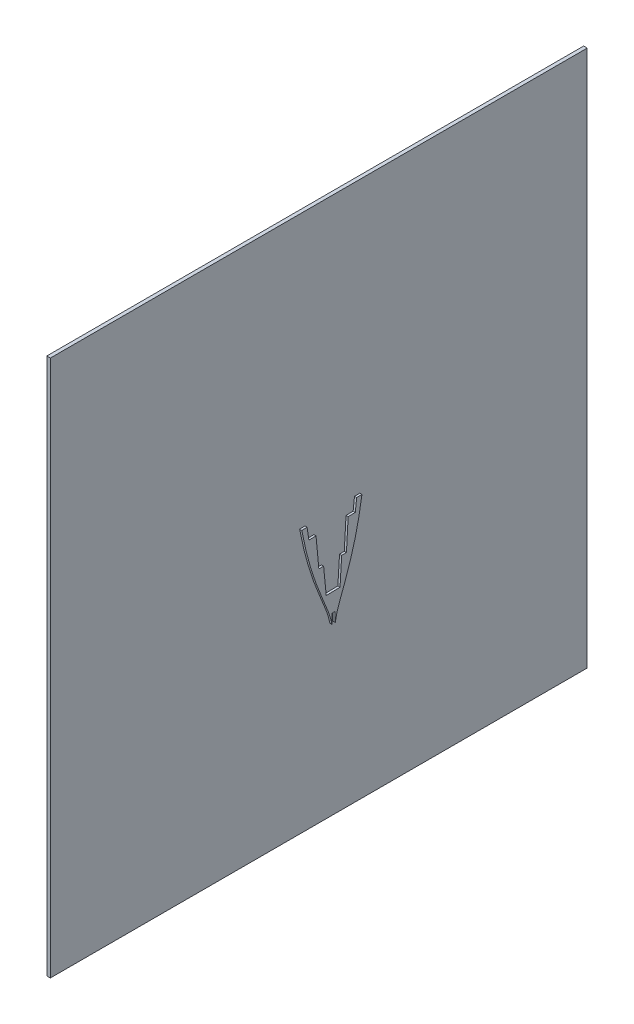
ISO-10303-21;
HEADER;
FILE_DESCRIPTION(('STEP AP214'),'2;1');
FILE_NAME('part.step','',(''),(''),'','','');
FILE_SCHEMA(('AUTOMOTIVE_DESIGN { 1 0 10303 214 1 1 1 1 }'));
ENDSEC;
DATA;
#1=APPLICATION_CONTEXT('core data for automotive mechanical design processes');
#2=APPLICATION_PROTOCOL_DEFINITION('international standard','automotive_design',2000,#1);
#3=PRODUCT_CONTEXT('',#1,'mechanical');
#4=PRODUCT('Part','Part','',(#3));
#5=PRODUCT_RELATED_PRODUCT_CATEGORY('part','',(#4));
#6=PRODUCT_DEFINITION_FORMATION('','',#4);
#7=PRODUCT_DEFINITION_CONTEXT('part definition',#1,'design');
#8=PRODUCT_DEFINITION('design','',#6,#7);
#9=PRODUCT_DEFINITION_SHAPE('','',#8);
#10=(LENGTH_UNIT() NAMED_UNIT(*) SI_UNIT(.MILLI.,.METRE.));
#11=(NAMED_UNIT(*) PLANE_ANGLE_UNIT() SI_UNIT($,.RADIAN.));
#12=(NAMED_UNIT(*) SI_UNIT($,.STERADIAN.) SOLID_ANGLE_UNIT());
#13=UNCERTAINTY_MEASURE_WITH_UNIT(LENGTH_MEASURE(1.E-05),#10,'distance_accuracy_value','');
#14=(GEOMETRIC_REPRESENTATION_CONTEXT(3) GLOBAL_UNCERTAINTY_ASSIGNED_CONTEXT((#13)) GLOBAL_UNIT_ASSIGNED_CONTEXT((#10,
#11,#12)) REPRESENTATION_CONTEXT('',''));
#15=CARTESIAN_POINT('',(0.,0.,0.));
#16=DIRECTION('',(0.,0.,1.));
#17=DIRECTION('',(1.,0.,0.));
#18=AXIS2_PLACEMENT_3D('',#15,#16,#17);
#19=CARTESIAN_POINT('',(6.,369.079430041121,90.7145035129025));
#20=CARTESIAN_POINT('',(6.,186.485173332269,57.0267938503836));
#21=CARTESIAN_POINT('',(6.,124.014601197404,2.24657128591706));
#22=CARTESIAN_POINT('',(6.,123.205843337659,2.23192033217919));
#23=CARTESIAN_POINT('',(6.,0.,0.));
#24=B_SPLINE_CURVE_WITH_KNOTS('',4,(#19,#20,#21,#22,#23),.UNSPECIFIED.,.F.,.F.,(5,5),(0.,1.),.UNSPECIFIED.);
#25=DIRECTION('',(-1.,0.,0.));
#26=VECTOR('',#25,1.);
#27=SURFACE_OF_LINEAR_EXTRUSION('',#24,#26);
#28=CARTESIAN_POINT('',(0.,369.079430041121,90.7145035129025));
#29=CARTESIAN_POINT('',(0.,186.485173332269,57.0267938503836));
#30=CARTESIAN_POINT('',(0.,124.014601197404,2.24657128591706));
#31=CARTESIAN_POINT('',(0.,123.205843337659,2.23192033217919));
#32=CARTESIAN_POINT('',(0.,0.,0.));
#33=B_SPLINE_CURVE_WITH_KNOTS('',4,(#28,#29,#30,#31,#32),.UNSPECIFIED.,.F.,.F.,(5,5),(0.,1.),.UNSPECIFIED.);
#34=CARTESIAN_POINT('',(0.,369.079430041121,90.7145035129025));
#35=VERTEX_POINT('',#34);
#36=CARTESIAN_POINT('',(0.,99.3171977063289,6.30064525545685));
#37=VERTEX_POINT('',#36);
#38=EDGE_CURVE('E194',#35,#37,#33,.T.);
#39=ORIENTED_EDGE('',*,*,#38,.T.);
#40=DIRECTION('',(1.,0.,0.));
#41=VECTOR('',#40,1.);
#42=CARTESIAN_POINT('',(0.,99.3171977063289,6.30064525545685));
#43=LINE('',#42,#41);
#44=CARTESIAN_POINT('',(6.,99.3171977063289,6.30064525545685));
#45=VERTEX_POINT('',#44);
#46=EDGE_CURVE('E200',#37,#45,#43,.T.);
#47=ORIENTED_EDGE('',*,*,#46,.T.);
#48=CARTESIAN_POINT('',(6.,369.079430041121,90.7145035129025));
#49=VERTEX_POINT('',#48);
#50=EDGE_CURVE('E234',#49,#45,#24,.T.);
#51=ORIENTED_EDGE('',*,*,#50,.F.);
#52=DIRECTION('',(-1.,0.,0.));
#53=VECTOR('',#52,1.);
#54=CARTESIAN_POINT('',(6.,369.079430041121,90.7145035129025));
#55=LINE('',#54,#53);
#56=EDGE_CURVE('E190',#49,#35,#55,.T.);
#57=ORIENTED_EDGE('',*,*,#56,.T.);
#58=EDGE_LOOP('',(#39,#47,#51,#57));
#59=FACE_BOUND('',#58,.T.);
#60=ADVANCED_FACE('F48',(#59),#27,.F.);
#61=CARTESIAN_POINT('',(6.,0.,0.));
#62=CARTESIAN_POINT('',(6.,123.205843337659,2.23192033217918));
#63=CARTESIAN_POINT('',(6.,124.014601197404,2.24657128591706));
#64=CARTESIAN_POINT('',(6.,188.42826292328,-50.2350955143506));
#65=CARTESIAN_POINT('',(6.,372.122846900139,-77.2873446432626));
#66=B_SPLINE_CURVE_WITH_KNOTS('',4,(#61,#62,#63,#64,#65),.UNSPECIFIED.,.F.,.F.,(5,5),(0.,1.),.UNSPECIFIED.);
#67=DIRECTION('',(-1.,0.,0.));
#68=VECTOR('',#67,1.);
#69=SURFACE_OF_LINEAR_EXTRUSION('',#66,#68);
#70=CARTESIAN_POINT('',(6.,99.480236101631,-2.69935474454315));
#71=VERTEX_POINT('',#70);
#72=CARTESIAN_POINT('',(6.,372.122846900139,-77.2873446432626));
#73=VERTEX_POINT('',#72);
#74=EDGE_CURVE('E131',#71,#73,#66,.T.);
#75=ORIENTED_EDGE('',*,*,#74,.F.);
#76=DIRECTION('',(1.,0.,0.));
#77=VECTOR('',#76,1.);
#78=CARTESIAN_POINT('',(0.,99.480236101631,-2.69935474454315));
#79=LINE('',#78,#77);
#80=CARTESIAN_POINT('',(0.,99.480236101631,-2.69935474454315));
#81=VERTEX_POINT('',#80);
#82=EDGE_CURVE('E326',#81,#71,#79,.T.);
#83=ORIENTED_EDGE('',*,*,#82,.F.);
#84=CARTESIAN_POINT('',(0.,0.,0.));
#85=CARTESIAN_POINT('',(0.,123.205843337659,2.23192033217918));
#86=CARTESIAN_POINT('',(0.,124.014601197404,2.24657128591706));
#87=CARTESIAN_POINT('',(0.,188.42826292328,-50.2350955143506));
#88=CARTESIAN_POINT('',(0.,372.122846900139,-77.2873446432626));
#89=B_SPLINE_CURVE_WITH_KNOTS('',4,(#84,#85,#86,#87,#88),.UNSPECIFIED.,.F.,.F.,(5,5),(0.,1.),.UNSPECIFIED.);
#90=CARTESIAN_POINT('',(0.,372.122846900139,-77.2873446432626));
#91=VERTEX_POINT('',#90);
#92=EDGE_CURVE('E199',#81,#91,#89,.T.);
#93=ORIENTED_EDGE('',*,*,#92,.T.);
#94=DIRECTION('',(-1.,0.,0.));
#95=VECTOR('',#94,1.);
#96=CARTESIAN_POINT('',(6.,372.122846900139,-77.2873446432626));
#97=LINE('',#96,#95);
#98=EDGE_CURVE('E13',#73,#91,#97,.T.);
#99=ORIENTED_EDGE('',*,*,#98,.F.);
#100=EDGE_LOOP('',(#75,#83,#93,#99));
#101=FACE_BOUND('',#100,.T.);
#102=ADVANCED_FACE('F338',(#101),#69,.F.);
#103=CARTESIAN_POINT('',(6.,372.122846900139,-77.2873446432626));
#104=DIRECTION('',(0.,-0.999835956927465,-0.0181124055536424));
#105=DIRECTION('',(0.,0.0181124055536424,-0.999835956927466));
#106=AXIS2_PLACEMENT_3D('',#103,#104,#105);
#107=PLANE('',#106);
#108=DIRECTION('',(0.,-0.0181124055536424,0.999835956927465));
#109=VECTOR('',#108,1.);
#110=CARTESIAN_POINT('',(0.,372.122846900139,-77.2873446432626));
#111=LINE('',#110,#109);
#112=CARTESIAN_POINT('',(0.,371.855243263812,-62.5151633881296));
#113=VERTEX_POINT('',#112);
#114=EDGE_CURVE('E207',#91,#113,#111,.T.);
#115=ORIENTED_EDGE('',*,*,#114,.T.);
#116=DIRECTION('',(-1.,0.,0.));
#117=VECTOR('',#116,1.);
#118=CARTESIAN_POINT('',(6.,371.855243263812,-62.5151633881296));
#119=LINE('',#118,#117);
#120=CARTESIAN_POINT('',(6.,371.855243263812,-62.5151633881296));
#121=VERTEX_POINT('',#120);
#122=EDGE_CURVE('E56',#121,#113,#119,.T.);
#123=ORIENTED_EDGE('',*,*,#122,.F.);
#124=DIRECTION('',(0.,-0.0181124055536424,0.999835956927465));
#125=VECTOR('',#124,1.);
#126=CARTESIAN_POINT('',(6.,372.122846900139,-77.2873446432626));
#127=LINE('',#126,#125);
#128=EDGE_CURVE('E320',#73,#121,#127,.T.);
#129=ORIENTED_EDGE('',*,*,#128,.F.);
#130=ORIENTED_EDGE('',*,*,#98,.T.);
#131=EDGE_LOOP('',(#115,#123,#129,#130));
#132=FACE_BOUND('',#131,.T.);
#133=ADVANCED_FACE('F341',(#132),#107,.F.);
#134=CARTESIAN_POINT('',(6.,371.855243263812,-62.5151633881296));
#135=DIRECTION('',(0.,-0.1115771381215,-0.99375577595736));
#136=DIRECTION('',(0.,0.993755775957361,-0.1115771381215));
#137=AXIS2_PLACEMENT_3D('',#134,#135,#136);
#138=PLANE('',#137);
#139=DIRECTION('',(0.,-0.993755775957361,0.1115771381215));
#140=VECTOR('',#139,1.);
#141=CARTESIAN_POINT('',(0.,371.855243263812,-62.5151633881296));
#142=LINE('',#141,#140);
#143=CARTESIAN_POINT('',(0.,337.907916836501,-58.7036177133518));
#144=VERTEX_POINT('',#143);
#145=EDGE_CURVE('E212',#113,#144,#142,.T.);
#146=ORIENTED_EDGE('',*,*,#145,.T.);
#147=DIRECTION('',(-1.,0.,0.));
#148=VECTOR('',#147,1.);
#149=CARTESIAN_POINT('',(6.,337.907916836501,-58.7036177133518));
#150=LINE('',#149,#148);
#151=CARTESIAN_POINT('',(6.,337.907916836501,-58.7036177133518));
#152=VERTEX_POINT('',#151);
#153=EDGE_CURVE('E259',#152,#144,#150,.T.);
#154=ORIENTED_EDGE('',*,*,#153,.F.);
#155=DIRECTION('',(0.,-0.993755775957361,0.1115771381215));
#156=VECTOR('',#155,1.);
#157=CARTESIAN_POINT('',(6.,371.855243263812,-62.5151633881296));
#158=LINE('',#157,#156);
#159=EDGE_CURVE('E268',#121,#152,#158,.T.);
#160=ORIENTED_EDGE('',*,*,#159,.F.);
#161=ORIENTED_EDGE('',*,*,#122,.T.);
#162=EDGE_LOOP('',(#146,#154,#160,#161));
#163=FACE_BOUND('',#162,.T.);
#164=ADVANCED_FACE('F266',(#163),#138,.F.);
#165=CARTESIAN_POINT('',(6.,337.907916836501,-58.7036177133518));
#166=DIRECTION('',(0.,-0.999835956927465,-0.0181124055536437));
#167=DIRECTION('',(0.,0.0181124055536437,-0.999835956927466));
#168=AXIS2_PLACEMENT_3D('',#165,#166,#167);
#169=PLANE('',#168);
#170=DIRECTION('',(0.,-0.0181124055536437,0.999835956927465));
#171=VECTOR('',#170,1.);
#172=CARTESIAN_POINT('',(0.,337.907916836501,-58.7036177133518));
#173=LINE('',#172,#171);
#174=CARTESIAN_POINT('',(0.,337.547213718344,-38.7921848426052));
#175=VERTEX_POINT('',#174);
#176=EDGE_CURVE('E214',#144,#175,#173,.T.);
#177=ORIENTED_EDGE('',*,*,#176,.T.);
#178=DIRECTION('',(-1.,0.,0.));
#179=VECTOR('',#178,1.);
#180=CARTESIAN_POINT('',(6.,337.547213718344,-38.7921848426052));
#181=LINE('',#180,#179);
#182=CARTESIAN_POINT('',(6.,337.547213718344,-38.7921848426052));
#183=VERTEX_POINT('',#182);
#184=EDGE_CURVE('E256',#183,#175,#181,.T.);
#185=ORIENTED_EDGE('',*,*,#184,.F.);
#186=DIRECTION('',(0.,-0.0181124055536437,0.999835956927465));
#187=VECTOR('',#186,1.);
#188=CARTESIAN_POINT('',(6.,337.907916836501,-58.7036177133518));
#189=LINE('',#188,#187);
#190=EDGE_CURVE('E290',#152,#183,#189,.T.);
#191=ORIENTED_EDGE('',*,*,#190,.F.);
#192=ORIENTED_EDGE('',*,*,#153,.T.);
#193=EDGE_LOOP('',(#177,#185,#191,#192));
#194=FACE_BOUND('',#193,.T.);
#195=ADVANCED_FACE('F281',(#194),#169,.F.);
#196=CARTESIAN_POINT('',(6.,337.547213718344,-38.7921848426052));
#197=DIRECTION('',(0.,-0.0572739284398144,-0.998358501301547));
#198=DIRECTION('',(0.,0.998358501301547,-0.0572739284398144));
#199=AXIS2_PLACEMENT_3D('',#196,#197,#198);
#200=PLANE('',#199);
#201=DIRECTION('',(0.,-0.998358501301547,0.0572739284398144));
#202=VECTOR('',#201,1.);
#203=CARTESIAN_POINT('',(0.,337.547213718344,-38.7921848426052));
#204=LINE('',#203,#202);
#205=CARTESIAN_POINT('',(0.,253.236366537389,-33.9554318907879));
#206=VERTEX_POINT('',#205);
#207=EDGE_CURVE('E216',#175,#206,#204,.T.);
#208=ORIENTED_EDGE('',*,*,#207,.T.);
#209=DIRECTION('',(-1.,0.,0.));
#210=VECTOR('',#209,1.);
#211=CARTESIAN_POINT('',(6.,253.236366537389,-33.9554318907879));
#212=LINE('',#211,#210);
#213=CARTESIAN_POINT('',(6.,253.236366537389,-33.9554318907879));
#214=VERTEX_POINT('',#213);
#215=EDGE_CURVE('E253',#214,#206,#212,.T.);
#216=ORIENTED_EDGE('',*,*,#215,.F.);
#217=DIRECTION('',(0.,-0.998358501301547,0.0572739284398144));
#218=VECTOR('',#217,1.);
#219=CARTESIAN_POINT('',(6.,337.547213718344,-38.7921848426052));
#220=LINE('',#219,#218);
#221=EDGE_CURVE('E287',#183,#214,#220,.T.);
#222=ORIENTED_EDGE('',*,*,#221,.F.);
#223=ORIENTED_EDGE('',*,*,#184,.T.);
#224=EDGE_LOOP('',(#208,#216,#222,#223));
#225=FACE_BOUND('',#224,.T.);
#226=ADVANCED_FACE('F285',(#225),#200,.F.);
#227=CARTESIAN_POINT('',(6.,253.236366537389,-33.9554318907879));
#228=DIRECTION('',(0.,-0.999835956927465,-0.0181124055536435));
#229=DIRECTION('',(0.,0.0181124055536435,-0.999835956927466));
#230=AXIS2_PLACEMENT_3D('',#227,#228,#229);
#231=PLANE('',#230);
#232=DIRECTION('',(0.,-0.0181124055536435,0.999835956927465));
#233=VECTOR('',#232,1.);
#234=CARTESIAN_POINT('',(0.,253.236366537389,-33.9554318907879));
#235=LINE('',#234,#233);
#236=CARTESIAN_POINT('',(0.,252.995462988032,-20.6571413857153));
#237=VERTEX_POINT('',#236);
#238=EDGE_CURVE('E218',#206,#237,#235,.T.);
#239=ORIENTED_EDGE('',*,*,#238,.T.);
#240=DIRECTION('',(-1.,0.,0.));
#241=VECTOR('',#240,1.);
#242=CARTESIAN_POINT('',(6.,252.995462988032,-20.6571413857153));
#243=LINE('',#242,#241);
#244=CARTESIAN_POINT('',(6.,252.995462988032,-20.6571413857153));
#245=VERTEX_POINT('',#244);
#246=EDGE_CURVE('E250',#245,#237,#243,.T.);
#247=ORIENTED_EDGE('',*,*,#246,.F.);
#248=DIRECTION('',(0.,-0.0181124055536435,0.999835956927465));
#249=VECTOR('',#248,1.);
#250=CARTESIAN_POINT('',(6.,253.236366537389,-33.9554318907879));
#251=LINE('',#250,#249);
#252=EDGE_CURVE('E289',#214,#245,#251,.T.);
#253=ORIENTED_EDGE('',*,*,#252,.F.);
#254=ORIENTED_EDGE('',*,*,#215,.T.);
#255=EDGE_LOOP('',(#239,#247,#253,#254));
#256=FACE_BOUND('',#255,.T.);
#257=ADVANCED_FACE('F351',(#256),#231,.F.);
#258=CARTESIAN_POINT('',(6.,252.995462988032,-20.6571413857153));
#259=DIRECTION('',(0.,-0.0615248779314967,-0.998105550227787));
#260=DIRECTION('',(0.,0.998105550227787,-0.0615248779314967));
#261=AXIS2_PLACEMENT_3D('',#258,#259,#260);
#262=PLANE('',#261);
#263=DIRECTION('',(0.,-0.998105550227787,0.0615248779314967));
#264=VECTOR('',#263,1.);
#265=CARTESIAN_POINT('',(0.,252.995462988032,-20.6571413857153));
#266=LINE('',#265,#264);
#267=CARTESIAN_POINT('',(0.,178.148864034189,-16.0434731587708));
#268=VERTEX_POINT('',#267);
#269=EDGE_CURVE('E220',#237,#268,#266,.T.);
#270=ORIENTED_EDGE('',*,*,#269,.T.);
#271=DIRECTION('',(-1.,0.,0.));
#272=VECTOR('',#271,1.);
#273=CARTESIAN_POINT('',(6.,178.148864034189,-16.0434731587708));
#274=LINE('',#273,#272);
#275=CARTESIAN_POINT('',(6.,178.148864034189,-16.0434731587708));
#276=VERTEX_POINT('',#275);
#277=EDGE_CURVE('E247',#276,#268,#274,.T.);
#278=ORIENTED_EDGE('',*,*,#277,.F.);
#279=DIRECTION('',(0.,-0.998105550227787,0.0615248779314967));
#280=VECTOR('',#279,1.);
#281=CARTESIAN_POINT('',(6.,252.995462988032,-20.6571413857153));
#282=LINE('',#281,#280);
#283=EDGE_CURVE('E292',#245,#276,#282,.T.);
#284=ORIENTED_EDGE('',*,*,#283,.F.);
#285=ORIENTED_EDGE('',*,*,#246,.T.);
#286=EDGE_LOOP('',(#270,#278,#284,#285));
#287=FACE_BOUND('',#286,.T.);
#288=ADVANCED_FACE('F354',(#287),#262,.F.);
#289=CARTESIAN_POINT('',(6.,178.148864034189,-16.0434731587708));
#290=DIRECTION('',(0.,-0.999835956927465,-0.0181124055536413));
#291=DIRECTION('',(0.,0.0181124055536413,-0.999835956927466));
#292=AXIS2_PLACEMENT_3D('',#289,#290,#291);
#293=PLANE('',#292);
#294=DIRECTION('',(0.,-0.0181124055536413,0.999835956927466));
#295=VECTOR('',#294,1.);
#296=CARTESIAN_POINT('',(0.,178.148864034189,-16.0434731587708));
#297=LINE('',#296,#295);
#298=CARTESIAN_POINT('',(0.,177.450900826632,22.485297051294));
#299=VERTEX_POINT('',#298);
#300=EDGE_CURVE('E222',#268,#299,#297,.T.);
#301=ORIENTED_EDGE('',*,*,#300,.T.);
#302=DIRECTION('',(-1.,0.,0.));
#303=VECTOR('',#302,1.);
#304=CARTESIAN_POINT('',(6.,177.450900826632,22.485297051294));
#305=LINE('',#304,#303);
#306=CARTESIAN_POINT('',(6.,177.450900826632,22.485297051294));
#307=VERTEX_POINT('',#306);
#308=EDGE_CURVE('E244',#307,#299,#305,.T.);
#309=ORIENTED_EDGE('',*,*,#308,.F.);
#310=DIRECTION('',(0.,-0.0181124055536413,0.999835956927466));
#311=VECTOR('',#310,1.);
#312=CARTESIAN_POINT('',(6.,178.148864034189,-16.0434731587708));
#313=LINE('',#312,#311);
#314=EDGE_CURVE('E298',#276,#307,#313,.T.);
#315=ORIENTED_EDGE('',*,*,#314,.F.);
#316=ORIENTED_EDGE('',*,*,#277,.T.);
#317=EDGE_LOOP('',(#301,#309,#315,#316));
#318=FACE_BOUND('',#317,.T.);
#319=ADVANCED_FACE('F358',(#318),#293,.F.);
#320=CARTESIAN_POINT('',(6.,252.081289700859,29.8067973038028));
#321=DIRECTION('',(0.,-0.0976347641731815,0.995222313267165));
#322=DIRECTION('',(0.,-0.995222313267165,-0.0976347641731815));
#323=AXIS2_PLACEMENT_3D('',#320,#321,#322);
#324=PLANE('',#323);
#325=DIRECTION('',(0.,0.995222313267165,0.0976347641731815));
#326=VECTOR('',#325,1.);
#327=CARTESIAN_POINT('',(0.,252.081289700859,29.8067973038028));
#328=LINE('',#327,#326);
#329=CARTESIAN_POINT('',(0.,252.081289700859,29.8067973038028));
#330=VERTEX_POINT('',#329);
#331=EDGE_CURVE('E224',#299,#330,#328,.T.);
#332=ORIENTED_EDGE('',*,*,#331,.T.);
#333=DIRECTION('',(-1.,0.,0.));
#334=VECTOR('',#333,1.);
#335=CARTESIAN_POINT('',(6.,252.081289700859,29.8067973038028));
#336=LINE('',#335,#334);
#337=CARTESIAN_POINT('',(6.,252.081289700859,29.8067973038028));
#338=VERTEX_POINT('',#337);
#339=EDGE_CURVE('E241',#338,#330,#336,.T.);
#340=ORIENTED_EDGE('',*,*,#339,.F.);
#341=DIRECTION('',(0.,0.995222313267165,0.0976347641731815));
#342=VECTOR('',#341,1.);
#343=CARTESIAN_POINT('',(6.,252.081289700859,29.8067973038028));
#344=LINE('',#343,#342);
#345=EDGE_CURVE('E300',#307,#338,#344,.T.);
#346=ORIENTED_EDGE('',*,*,#345,.F.);
#347=ORIENTED_EDGE('',*,*,#308,.T.);
#348=EDGE_LOOP('',(#332,#340,#346,#347));
#349=FACE_BOUND('',#348,.T.);
#350=ADVANCED_FACE('F362',(#349),#324,.F.);
#351=CARTESIAN_POINT('',(6.,251.840386151502,43.1050878088755));
#352=DIRECTION('',(0.,-0.999835956927465,-0.0181124055536435));
#353=DIRECTION('',(0.,0.0181124055536435,-0.999835956927466));
#354=AXIS2_PLACEMENT_3D('',#351,#352,#353);
#355=PLANE('',#354);
#356=DIRECTION('',(0.,-0.0181124055536435,0.999835956927465));
#357=VECTOR('',#356,1.);
#358=CARTESIAN_POINT('',(0.,251.840386151502,43.1050878088755));
#359=LINE('',#358,#357);
#360=CARTESIAN_POINT('',(0.,251.840386151502,43.1050878088755));
#361=VERTEX_POINT('',#360);
#362=EDGE_CURVE('E226',#330,#361,#359,.T.);
#363=ORIENTED_EDGE('',*,*,#362,.T.);
#364=DIRECTION('',(-1.,0.,0.));
#365=VECTOR('',#364,1.);
#366=CARTESIAN_POINT('',(6.,251.840386151502,43.1050878088755));
#367=LINE('',#366,#365);
#368=CARTESIAN_POINT('',(6.,251.840386151502,43.1050878088755));
#369=VERTEX_POINT('',#368);
#370=EDGE_CURVE('E238',#369,#361,#367,.T.);
#371=ORIENTED_EDGE('',*,*,#370,.F.);
#372=DIRECTION('',(0.,-0.0181124055536435,0.999835956927465));
#373=VECTOR('',#372,1.);
#374=CARTESIAN_POINT('',(6.,251.840386151502,43.1050878088755));
#375=LINE('',#374,#373);
#376=EDGE_CURVE('E302',#338,#369,#375,.T.);
#377=ORIENTED_EDGE('',*,*,#376,.F.);
#378=ORIENTED_EDGE('',*,*,#339,.T.);
#379=EDGE_LOOP('',(#363,#371,#377,#378));
#380=FACE_BOUND('',#379,.T.);
#381=ADVANCED_FACE('F308',(#380),#355,.F.);
#382=CARTESIAN_POINT('',(6.,335.920733708421,50.9923107799222));
#383=DIRECTION('',(0.,-0.0933957654096977,0.995629062956449));
#384=DIRECTION('',(0.,-0.995629062956449,-0.0933957654096977));
#385=AXIS2_PLACEMENT_3D('',#382,#383,#384);
#386=PLANE('',#385);
#387=DIRECTION('',(0.,0.995629062956449,0.0933957654096977));
#388=VECTOR('',#387,1.);
#389=CARTESIAN_POINT('',(0.,335.920733708421,50.9923107799222));
#390=LINE('',#389,#388);
#391=CARTESIAN_POINT('',(0.,335.920733708421,50.9923107799222));
#392=VERTEX_POINT('',#391);
#393=EDGE_CURVE('E228',#361,#392,#390,.T.);
#394=ORIENTED_EDGE('',*,*,#393,.T.);
#395=DIRECTION('',(-1.,0.,0.));
#396=VECTOR('',#395,1.);
#397=CARTESIAN_POINT('',(6.,335.920733708421,50.9923107799222));
#398=LINE('',#397,#396);
#399=CARTESIAN_POINT('',(6.,335.920733708421,50.9923107799222));
#400=VERTEX_POINT('',#399);
#401=EDGE_CURVE('E185',#400,#392,#398,.T.);
#402=ORIENTED_EDGE('',*,*,#401,.F.);
#403=DIRECTION('',(0.,0.995629062956449,0.0933957654096977));
#404=VECTOR('',#403,1.);
#405=CARTESIAN_POINT('',(6.,335.920733708421,50.9923107799222));
#406=LINE('',#405,#404);
#407=EDGE_CURVE('E173',#369,#400,#406,.T.);
#408=ORIENTED_EDGE('',*,*,#407,.F.);
#409=ORIENTED_EDGE('',*,*,#370,.T.);
#410=EDGE_LOOP('',(#394,#402,#408,#409));
#411=FACE_BOUND('',#410,.T.);
#412=ADVANCED_FACE('F312',(#411),#386,.F.);
#413=CARTESIAN_POINT('',(6.,335.560030590264,70.9037436506688));
#414=DIRECTION('',(0.,-0.999835956927465,-0.018112405553641));
#415=DIRECTION('',(0.,0.018112405553641,-0.999835956927466));
#416=AXIS2_PLACEMENT_3D('',#413,#414,#415);
#417=PLANE('',#416);
#418=DIRECTION('',(0.,-0.018112405553641,0.999835956927465));
#419=VECTOR('',#418,1.);
#420=CARTESIAN_POINT('',(0.,335.560030590264,70.9037436506688));
#421=LINE('',#420,#419);
#422=CARTESIAN_POINT('',(0.,335.560030590264,70.9037436506688));
#423=VERTEX_POINT('',#422);
#424=EDGE_CURVE('E182',#392,#423,#421,.T.);
#425=ORIENTED_EDGE('',*,*,#424,.T.);
#426=DIRECTION('',(-1.,0.,0.));
#427=VECTOR('',#426,1.);
#428=CARTESIAN_POINT('',(6.,335.560030590264,70.9037436506688));
#429=LINE('',#428,#427);
#430=CARTESIAN_POINT('',(6.,335.560030590264,70.9037436506688));
#431=VERTEX_POINT('',#430);
#432=EDGE_CURVE('E179',#431,#423,#429,.T.);
#433=ORIENTED_EDGE('',*,*,#432,.F.);
#434=DIRECTION('',(0.,-0.018112405553641,0.999835956927465));
#435=VECTOR('',#434,1.);
#436=CARTESIAN_POINT('',(6.,335.560030590264,70.9037436506688));
#437=LINE('',#436,#435);
#438=EDGE_CURVE('E166',#400,#431,#437,.T.);
#439=ORIENTED_EDGE('',*,*,#438,.F.);
#440=ORIENTED_EDGE('',*,*,#401,.T.);
#441=EDGE_LOOP('',(#425,#433,#439,#440));
#442=FACE_BOUND('',#441,.T.);
#443=ADVANCED_FACE('F180',(#442),#417,.F.);
#444=CARTESIAN_POINT('',(6.,369.347033677448,75.9423222577695));
#445=DIRECTION('',(0.,-0.147496640247735,0.989062556725119));
#446=DIRECTION('',(0.,-0.98906255672512,-0.147496640247735));
#447=AXIS2_PLACEMENT_3D('',#444,#445,#446);
#448=PLANE('',#447);
#449=DIRECTION('',(0.,0.98906255672512,0.147496640247735));
#450=VECTOR('',#449,1.);
#451=CARTESIAN_POINT('',(0.,369.347033677448,75.9423222577695));
#452=LINE('',#451,#450);
#453=CARTESIAN_POINT('',(0.,369.347033677448,75.9423222577695));
#454=VERTEX_POINT('',#453);
#455=EDGE_CURVE('E231',#423,#454,#452,.T.);
#456=ORIENTED_EDGE('',*,*,#455,.T.);
#457=DIRECTION('',(-1.,0.,0.));
#458=VECTOR('',#457,1.);
#459=CARTESIAN_POINT('',(6.,369.347033677448,75.9423222577695));
#460=LINE('',#459,#458);
#461=CARTESIAN_POINT('',(6.,369.347033677448,75.9423222577695));
#462=VERTEX_POINT('',#461);
#463=EDGE_CURVE('E186',#462,#454,#460,.T.);
#464=ORIENTED_EDGE('',*,*,#463,.F.);
#465=DIRECTION('',(0.,0.98906255672512,0.147496640247735));
#466=VECTOR('',#465,1.);
#467=CARTESIAN_POINT('',(6.,369.347033677448,75.9423222577695));
#468=LINE('',#467,#466);
#469=EDGE_CURVE('E170',#431,#462,#468,.T.);
#470=ORIENTED_EDGE('',*,*,#469,.F.);
#471=ORIENTED_EDGE('',*,*,#432,.T.);
#472=EDGE_LOOP('',(#456,#464,#470,#471));
#473=FACE_BOUND('',#472,.T.);
#474=ADVANCED_FACE('F188',(#473),#448,.F.);
#475=CARTESIAN_POINT('',(6.,369.079430041121,90.7145035129025));
#476=DIRECTION('',(0.,-0.999835956927465,-0.0181124055536462));
#477=DIRECTION('',(0.,0.0181124055536462,-0.999835956927465));
#478=AXIS2_PLACEMENT_3D('',#475,#476,#477);
#479=PLANE('',#478);
#480=DIRECTION('',(0.,-0.0181124055536462,0.999835956927465));
#481=VECTOR('',#480,1.);
#482=CARTESIAN_POINT('',(0.,369.079430041121,90.7145035129025));
#483=LINE('',#482,#481);
#484=EDGE_CURVE('E123',#454,#35,#483,.T.);
#485=ORIENTED_EDGE('',*,*,#484,.T.);
#486=ORIENTED_EDGE('',*,*,#56,.F.);
#487=DIRECTION('',(0.,-0.0181124055536462,0.999835956927465));
#488=VECTOR('',#487,1.);
#489=CARTESIAN_POINT('',(6.,369.079430041121,90.7145035129025));
#490=LINE('',#489,#488);
#491=EDGE_CURVE('E72',#462,#49,#490,.T.);
#492=ORIENTED_EDGE('',*,*,#491,.F.);
#493=ORIENTED_EDGE('',*,*,#463,.T.);
#494=EDGE_LOOP('',(#485,#486,#492,#493));
#495=FACE_BOUND('',#494,.T.);
#496=ADVANCED_FACE('F314',(#495),#479,.F.);
#497=CARTESIAN_POINT('',(6.,146.995693994078,21.326799247416));
#498=DIRECTION('',(-1.,0.,0.));
#499=DIRECTION('',(0.,0.,1.));
#500=AXIS2_PLACEMENT_3D('',#497,#498,#499);
#501=PLANE('',#500);
#502=ORIENTED_EDGE('',*,*,#50,.T.);
#503=DIRECTION('',(0.,-0.999835956927465,-0.018112405553643));
#504=VECTOR('',#503,1.);
#505=CARTESIAN_POINT('',(6.,99.3171977063289,6.30064525545685));
#506=LINE('',#505,#504);
#507=CARTESIAN_POINT('',(6.,126.317197706329,6.78976044136313));
#508=VERTEX_POINT('',#507);
#509=EDGE_CURVE('E514',#508,#45,#506,.T.);
#510=ORIENTED_EDGE('',*,*,#509,.F.);
#511=DIRECTION('',(0.,-0.0181124055536438,0.999835956927465));
#512=VECTOR('',#511,1.);
#513=CARTESIAN_POINT('',(6.,126.317197706329,6.78976044136313));
#514=LINE('',#513,#512);
#515=CARTESIAN_POINT('',(6.,126.480236101631,-2.21023955863687));
#516=VERTEX_POINT('',#515);
#517=EDGE_CURVE('E522',#516,#508,#514,.T.);
#518=ORIENTED_EDGE('',*,*,#517,.F.);
#519=DIRECTION('',(0.,0.999835956927465,0.0181124055536428));
#520=VECTOR('',#519,1.);
#521=CARTESIAN_POINT('',(6.,126.480236101631,-2.21023955863687));
#522=LINE('',#521,#520);
#523=EDGE_CURVE('E526',#71,#516,#522,.T.);
#524=ORIENTED_EDGE('',*,*,#523,.F.);
#525=ORIENTED_EDGE('',*,*,#74,.T.);
#526=ORIENTED_EDGE('',*,*,#128,.T.);
#527=ORIENTED_EDGE('',*,*,#159,.T.);
#528=ORIENTED_EDGE('',*,*,#190,.T.);
#529=ORIENTED_EDGE('',*,*,#221,.T.);
#530=ORIENTED_EDGE('',*,*,#252,.T.);
#531=ORIENTED_EDGE('',*,*,#283,.T.);
#532=ORIENTED_EDGE('',*,*,#314,.T.);
#533=ORIENTED_EDGE('',*,*,#345,.T.);
#534=ORIENTED_EDGE('',*,*,#376,.T.);
#535=ORIENTED_EDGE('',*,*,#407,.T.);
#536=ORIENTED_EDGE('',*,*,#438,.T.);
#537=ORIENTED_EDGE('',*,*,#469,.T.);
#538=ORIENTED_EDGE('',*,*,#491,.T.);
#539=EDGE_LOOP('',(#502,#510,#518,#524,#525,#526,#527,#528,#529,#530,#531,#532,#533,#534,#535,
#536,#537,#538));
#540=FACE_BOUND('',#539,.T.);
#541=ADVANCED_FACE('F168',(#540),#501,.F.);
#542=CARTESIAN_POINT('',(0.,146.995693994078,21.326799247416));
#543=DIRECTION('',(-1.,0.,0.));
#544=DIRECTION('',(0.,0.,1.));
#545=AXIS2_PLACEMENT_3D('',#542,#543,#544);
#546=PLANE('',#545);
#547=DIRECTION('',(0.,-0.999835956927465,-0.018112405553643));
#548=VECTOR('',#547,1.);
#549=CARTESIAN_POINT('',(0.,99.3171977063289,6.30064525545685));
#550=LINE('',#549,#548);
#551=CARTESIAN_POINT('',(0.,126.317197706329,6.78976044136313));
#552=VERTEX_POINT('',#551);
#553=EDGE_CURVE('E535',#552,#37,#550,.T.);
#554=ORIENTED_EDGE('',*,*,#553,.T.);
#555=ORIENTED_EDGE('',*,*,#38,.F.);
#556=ORIENTED_EDGE('',*,*,#484,.F.);
#557=ORIENTED_EDGE('',*,*,#455,.F.);
#558=ORIENTED_EDGE('',*,*,#424,.F.);
#559=ORIENTED_EDGE('',*,*,#393,.F.);
#560=ORIENTED_EDGE('',*,*,#362,.F.);
#561=ORIENTED_EDGE('',*,*,#331,.F.);
#562=ORIENTED_EDGE('',*,*,#300,.F.);
#563=ORIENTED_EDGE('',*,*,#269,.F.);
#564=ORIENTED_EDGE('',*,*,#238,.F.);
#565=ORIENTED_EDGE('',*,*,#207,.F.);
#566=ORIENTED_EDGE('',*,*,#176,.F.);
#567=ORIENTED_EDGE('',*,*,#145,.F.);
#568=ORIENTED_EDGE('',*,*,#114,.F.);
#569=ORIENTED_EDGE('',*,*,#92,.F.);
#570=DIRECTION('',(0.,0.999835956927465,0.0181124055536428));
#571=VECTOR('',#570,1.);
#572=CARTESIAN_POINT('',(0.,126.480236101631,-2.21023955863687));
#573=LINE('',#572,#571);
#574=CARTESIAN_POINT('',(0.,126.480236101631,-2.21023955863687));
#575=VERTEX_POINT('',#574);
#576=EDGE_CURVE('E521',#81,#575,#573,.T.);
#577=ORIENTED_EDGE('',*,*,#576,.T.);
#578=DIRECTION('',(0.,-0.0181124055536438,0.999835956927465));
#579=VECTOR('',#578,1.);
#580=CARTESIAN_POINT('',(0.,126.317197706329,6.78976044136313));
#581=LINE('',#580,#579);
#582=EDGE_CURVE('E63',#575,#552,#581,.T.);
#583=ORIENTED_EDGE('',*,*,#582,.T.);
#584=EDGE_LOOP('',(#554,#555,#556,#557,#558,#559,#560,#561,#562,#563,#564,#565,#566,#567,#568,
#569,#577,#583));
#585=FACE_BOUND('',#584,.T.);
#586=ADVANCED_FACE('F275',(#585),#546,.T.);
#587=CARTESIAN_POINT('',(0.,99.3171977063289,6.30064525545685));
#588=DIRECTION('',(0.,-0.018112405553643,0.999835956927465));
#589=DIRECTION('',(0.,-0.999835956927466,-0.018112405553643));
#590=AXIS2_PLACEMENT_3D('',#587,#588,#589);
#591=PLANE('',#590);
#592=ORIENTED_EDGE('',*,*,#509,.T.);
#593=ORIENTED_EDGE('',*,*,#46,.F.);
#594=ORIENTED_EDGE('',*,*,#553,.F.);
#595=DIRECTION('',(1.,0.,0.));
#596=VECTOR('',#595,1.);
#597=CARTESIAN_POINT('',(0.,126.317197706329,6.78976044136313));
#598=LINE('',#597,#596);
#599=EDGE_CURVE('E517',#552,#508,#598,.T.);
#600=ORIENTED_EDGE('',*,*,#599,.T.);
#601=EDGE_LOOP('',(#592,#593,#594,#600));
#602=FACE_BOUND('',#601,.T.);
#603=ADVANCED_FACE('F379',(#602),#591,.F.);
#604=CARTESIAN_POINT('',(0.,126.317197706329,6.78976044136313));
#605=DIRECTION('',(0.,0.999835956927465,0.0181124055536438));
#606=DIRECTION('',(0.,-0.0181124055536438,0.999835956927466));
#607=AXIS2_PLACEMENT_3D('',#604,#605,#606);
#608=PLANE('',#607);
#609=ORIENTED_EDGE('',*,*,#517,.T.);
#610=ORIENTED_EDGE('',*,*,#599,.F.);
#611=ORIENTED_EDGE('',*,*,#582,.F.);
#612=DIRECTION('',(1.,0.,0.));
#613=VECTOR('',#612,1.);
#614=CARTESIAN_POINT('',(0.,126.480236101631,-2.21023955863687));
#615=LINE('',#614,#613);
#616=EDGE_CURVE('E531',#575,#516,#615,.T.);
#617=ORIENTED_EDGE('',*,*,#616,.T.);
#618=EDGE_LOOP('',(#609,#610,#611,#617));
#619=FACE_BOUND('',#618,.T.);
#620=ADVANCED_FACE('F385',(#619),#608,.F.);
#621=CARTESIAN_POINT('',(0.,126.480236101631,-2.21023955863687));
#622=DIRECTION('',(0.,0.0181124055536428,-0.999835956927465));
#623=DIRECTION('',(0.,0.999835956927466,0.0181124055536428));
#624=AXIS2_PLACEMENT_3D('',#621,#622,#623);
#625=PLANE('',#624);
#626=ORIENTED_EDGE('',*,*,#523,.T.);
#627=ORIENTED_EDGE('',*,*,#616,.F.);
#628=ORIENTED_EDGE('',*,*,#576,.F.);
#629=ORIENTED_EDGE('',*,*,#82,.T.);
#630=EDGE_LOOP('',(#626,#627,#628,#629));
#631=FACE_BOUND('',#630,.T.);
#632=ADVANCED_FACE('F382',(#631),#625,.F.);
#633=CLOSED_SHELL('',(#60,#102,#133,#164,#195,#226,#257,#288,#319,#350,#381,#412,#443,#474,#496,
#541,#586,#603,#620,#632));
#634=MANIFOLD_SOLID_BREP('B2',#633);
#635=CARTESIAN_POINT('',(-10.,0.,0.));
#636=DIRECTION('',(-1.,0.,0.));
#637=DIRECTION('',(0.,0.,1.));
#638=AXIS2_PLACEMENT_3D('',#635,#636,#637);
#639=PLANE('',#638);
#640=DIRECTION('',(0.,0.,-1.));
#641=VECTOR('',#640,1.);
#642=CARTESIAN_POINT('',(-10.,-378.710653275796,777.274991403029));
#643=LINE('',#642,#641);
#644=CARTESIAN_POINT('',(-10.,-378.710653275796,777.274991403029));
#645=VERTEX_POINT('',#644);
#646=CARTESIAN_POINT('',(-10.,-378.710653275796,-722.725008596971));
#647=VERTEX_POINT('',#646);
#648=EDGE_CURVE('E566',#645,#647,#643,.T.);
#649=ORIENTED_EDGE('',*,*,#648,.T.);
#650=DIRECTION('',(0.,-1.,0.));
#651=VECTOR('',#650,1.);
#652=CARTESIAN_POINT('',(-10.,1121.2893467242,-722.725008596971));
#653=LINE('',#652,#651);
#654=CARTESIAN_POINT('',(-10.,1121.2893467242,-722.725008596971));
#655=VERTEX_POINT('',#654);
#656=EDGE_CURVE('E600',#655,#647,#653,.T.);
#657=ORIENTED_EDGE('',*,*,#656,.F.);
#658=DIRECTION('',(0.,0.,-1.));
#659=VECTOR('',#658,1.);
#660=CARTESIAN_POINT('',(-10.,1121.2893467242,777.274991403029));
#661=LINE('',#660,#659);
#662=CARTESIAN_POINT('',(-10.,1121.2893467242,777.274991403029));
#663=VERTEX_POINT('',#662);
#664=EDGE_CURVE('E597',#663,#655,#661,.T.);
#665=ORIENTED_EDGE('',*,*,#664,.F.);
#666=DIRECTION('',(0.,-1.,0.));
#667=VECTOR('',#666,1.);
#668=CARTESIAN_POINT('',(-10.,1121.2893467242,777.274991403029));
#669=LINE('',#668,#667);
#670=EDGE_CURVE('E594',#663,#645,#669,.T.);
#671=ORIENTED_EDGE('',*,*,#670,.T.);
#672=EDGE_LOOP('',(#649,#657,#665,#671));
#673=FACE_BOUND('',#672,.T.);
#674=ADVANCED_FACE('F557',(#673),#639,.F.);
#675=CARTESIAN_POINT('',(-20.,0.,0.));
#676=DIRECTION('',(-1.,0.,0.));
#677=DIRECTION('',(0.,0.,1.));
#678=AXIS2_PLACEMENT_3D('',#675,#676,#677);
#679=PLANE('',#678);
#680=DIRECTION('',(0.,0.,-1.));
#681=VECTOR('',#680,1.);
#682=CARTESIAN_POINT('',(-20.,-378.710653275796,777.274991403029));
#683=LINE('',#682,#681);
#684=CARTESIAN_POINT('',(-20.,-378.710653275796,777.274991403029));
#685=VERTEX_POINT('',#684);
#686=CARTESIAN_POINT('',(-20.,-378.710653275796,-722.725008596971));
#687=VERTEX_POINT('',#686);
#688=EDGE_CURVE('E46',#685,#687,#683,.T.);
#689=ORIENTED_EDGE('',*,*,#688,.F.);
#690=DIRECTION('',(0.,-1.,0.));
#691=VECTOR('',#690,1.);
#692=CARTESIAN_POINT('',(-20.,1121.2893467242,777.274991403029));
#693=LINE('',#692,#691);
#694=CARTESIAN_POINT('',(-20.,1121.2893467242,777.274991403029));
#695=VERTEX_POINT('',#694);
#696=EDGE_CURVE('E613',#695,#685,#693,.T.);
#697=ORIENTED_EDGE('',*,*,#696,.F.);
#698=DIRECTION('',(0.,0.,-1.));
#699=VECTOR('',#698,1.);
#700=CARTESIAN_POINT('',(-20.,1121.2893467242,777.274991403029));
#701=LINE('',#700,#699);
#702=CARTESIAN_POINT('',(-20.,1121.2893467242,-722.725008596971));
#703=VERTEX_POINT('',#702);
#704=EDGE_CURVE('E604',#695,#703,#701,.T.);
#705=ORIENTED_EDGE('',*,*,#704,.T.);
#706=DIRECTION('',(0.,-1.,0.));
#707=VECTOR('',#706,1.);
#708=CARTESIAN_POINT('',(-20.,1121.2893467242,-722.725008596971));
#709=LINE('',#708,#707);
#710=EDGE_CURVE('E575',#703,#687,#709,.T.);
#711=ORIENTED_EDGE('',*,*,#710,.T.);
#712=EDGE_LOOP('',(#689,#697,#705,#711));
#713=FACE_BOUND('',#712,.T.);
#714=ADVANCED_FACE('F653',(#713),#679,.T.);
#715=CARTESIAN_POINT('',(-20.,1121.2893467242,777.274991403029));
#716=DIRECTION('',(0.,0.,1.));
#717=DIRECTION('',(1.,0.,0.));
#718=AXIS2_PLACEMENT_3D('',#715,#716,#717);
#719=PLANE('',#718);
#720=ORIENTED_EDGE('',*,*,#670,.F.);
#721=DIRECTION('',(1.,0.,0.));
#722=VECTOR('',#721,1.);
#723=CARTESIAN_POINT('',(-20.,1121.2893467242,777.274991403029));
#724=LINE('',#723,#722);
#725=EDGE_CURVE('E609',#695,#663,#724,.T.);
#726=ORIENTED_EDGE('',*,*,#725,.F.);
#727=ORIENTED_EDGE('',*,*,#696,.T.);
#728=DIRECTION('',(1.,0.,0.));
#729=VECTOR('',#728,1.);
#730=CARTESIAN_POINT('',(-20.,-378.710653275796,777.274991403029));
#731=LINE('',#730,#729);
#732=EDGE_CURVE('E605',#685,#645,#731,.T.);
#733=ORIENTED_EDGE('',*,*,#732,.T.);
#734=EDGE_LOOP('',(#720,#726,#727,#733));
#735=FACE_BOUND('',#734,.T.);
#736=ADVANCED_FACE('F614',(#735),#719,.T.);
#737=CARTESIAN_POINT('',(-20.,-378.710653275796,777.274991403029));
#738=DIRECTION('',(0.,-1.,0.));
#739=DIRECTION('',(0.,0.,-1.));
#740=AXIS2_PLACEMENT_3D('',#737,#738,#739);
#741=PLANE('',#740);
#742=ORIENTED_EDGE('',*,*,#648,.F.);
#743=ORIENTED_EDGE('',*,*,#732,.F.);
#744=ORIENTED_EDGE('',*,*,#688,.T.);
#745=DIRECTION('',(1.,0.,0.));
#746=VECTOR('',#745,1.);
#747=CARTESIAN_POINT('',(-20.,-378.710653275796,-722.725008596971));
#748=LINE('',#747,#746);
#749=EDGE_CURVE('E625',#687,#647,#748,.T.);
#750=ORIENTED_EDGE('',*,*,#749,.T.);
#751=EDGE_LOOP('',(#742,#743,#744,#750));
#752=FACE_BOUND('',#751,.T.);
#753=ADVANCED_FACE('F655',(#752),#741,.T.);
#754=CARTESIAN_POINT('',(-20.,1121.2893467242,777.274991403029));
#755=DIRECTION('',(0.,-1.,0.));
#756=DIRECTION('',(0.,0.,-1.));
#757=AXIS2_PLACEMENT_3D('',#754,#755,#756);
#758=PLANE('',#757);
#759=ORIENTED_EDGE('',*,*,#664,.T.);
#760=DIRECTION('',(1.,0.,0.));
#761=VECTOR('',#760,1.);
#762=CARTESIAN_POINT('',(-20.,1121.2893467242,-722.725008596971));
#763=LINE('',#762,#761);
#764=EDGE_CURVE('E629',#703,#655,#763,.T.);
#765=ORIENTED_EDGE('',*,*,#764,.F.);
#766=ORIENTED_EDGE('',*,*,#704,.F.);
#767=ORIENTED_EDGE('',*,*,#725,.T.);
#768=EDGE_LOOP('',(#759,#765,#766,#767));
#769=FACE_BOUND('',#768,.T.);
#770=ADVANCED_FACE('F610',(#769),#758,.F.);
#771=CARTESIAN_POINT('',(-20.,1121.2893467242,-722.725008596971));
#772=DIRECTION('',(0.,0.,1.));
#773=DIRECTION('',(1.,0.,0.));
#774=AXIS2_PLACEMENT_3D('',#771,#772,#773);
#775=PLANE('',#774);
#776=ORIENTED_EDGE('',*,*,#656,.T.);
#777=ORIENTED_EDGE('',*,*,#749,.F.);
#778=ORIENTED_EDGE('',*,*,#710,.F.);
#779=ORIENTED_EDGE('',*,*,#764,.T.);
#780=EDGE_LOOP('',(#776,#777,#778,#779));
#781=FACE_BOUND('',#780,.T.);
#782=ADVANCED_FACE('F640',(#781),#775,.F.);
#783=CLOSED_SHELL('',(#674,#714,#736,#753,#770,#782));
#784=MANIFOLD_SOLID_BREP('B7_NOT_SHOWN',#783);
#785=ADVANCED_BREP_SHAPE_REPRESENTATION('',(#18,#634,#784),#14);
#786=SHAPE_DEFINITION_REPRESENTATION(#9,#785);
ENDSEC;
END-ISO-10303-21;
